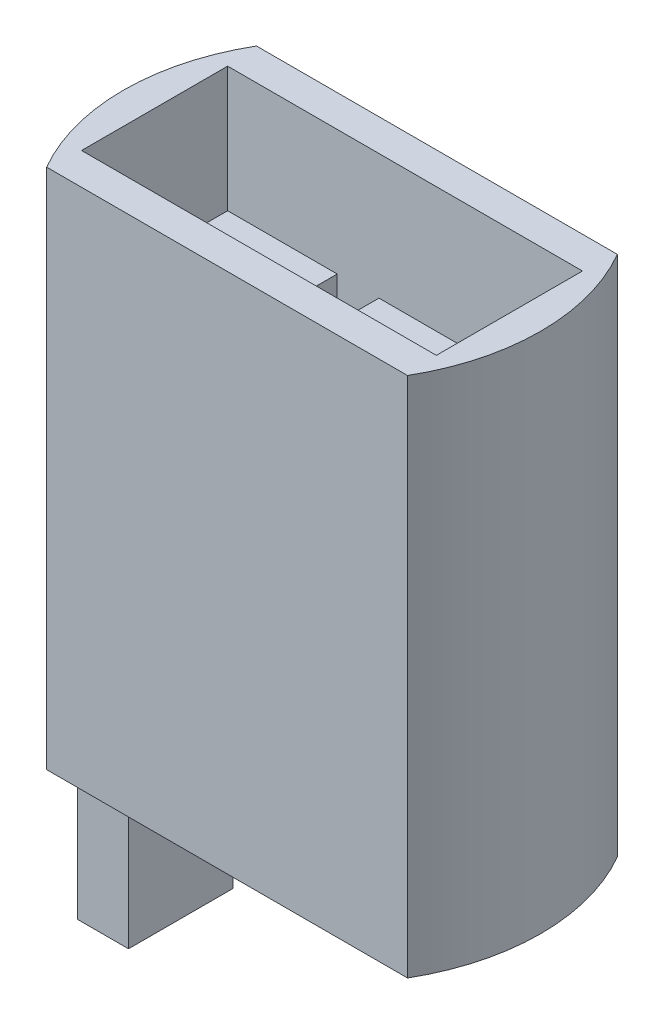
ISO-10303-21;
HEADER;
FILE_DESCRIPTION(('STEP AP214'),'2;1');
FILE_NAME('part.step','',(''),(''),'','','');
FILE_SCHEMA(('AUTOMOTIVE_DESIGN { 1 0 10303 214 1 1 1 1 }'));
ENDSEC;
DATA;
#1=APPLICATION_CONTEXT('core data for automotive mechanical design processes');
#2=APPLICATION_PROTOCOL_DEFINITION('international standard','automotive_design',2000,#1);
#3=PRODUCT_CONTEXT('',#1,'mechanical');
#4=PRODUCT('Part','Part','',(#3));
#5=PRODUCT_RELATED_PRODUCT_CATEGORY('part','',(#4));
#6=PRODUCT_DEFINITION_FORMATION('','',#4);
#7=PRODUCT_DEFINITION_CONTEXT('part definition',#1,'design');
#8=PRODUCT_DEFINITION('design','',#6,#7);
#9=PRODUCT_DEFINITION_SHAPE('','',#8);
#10=(LENGTH_UNIT() NAMED_UNIT(*) SI_UNIT(.MILLI.,.METRE.));
#11=(NAMED_UNIT(*) PLANE_ANGLE_UNIT() SI_UNIT($,.RADIAN.));
#12=(NAMED_UNIT(*) SI_UNIT($,.STERADIAN.) SOLID_ANGLE_UNIT());
#13=UNCERTAINTY_MEASURE_WITH_UNIT(LENGTH_MEASURE(1.E-05),#10,'distance_accuracy_value','');
#14=(GEOMETRIC_REPRESENTATION_CONTEXT(3) GLOBAL_UNCERTAINTY_ASSIGNED_CONTEXT((#13)) GLOBAL_UNIT_ASSIGNED_CONTEXT((#10,
#11,#12)) REPRESENTATION_CONTEXT('',''));
#15=CARTESIAN_POINT('',(0.,0.,0.));
#16=DIRECTION('',(0.,0.,1.));
#17=DIRECTION('',(1.,0.,0.));
#18=AXIS2_PLACEMENT_3D('',#15,#16,#17);
#19=CARTESIAN_POINT('',(-8.5,-8.,-2.5));
#20=DIRECTION('',(1.,0.,0.));
#21=DIRECTION('',(0.,0.,-1.));
#22=AXIS2_PLACEMENT_3D('',#19,#20,#21);
#23=PLANE('',#22);
#24=DIRECTION('',(0.,-1.,0.));
#25=VECTOR('',#24,1.);
#26=CARTESIAN_POINT('',(-8.5,-8.,1.5));
#27=LINE('',#26,#25);
#28=CARTESIAN_POINT('',(-8.5,-0.75,1.5));
#29=VERTEX_POINT('',#28);
#30=CARTESIAN_POINT('',(-8.5,-8.,1.5));
#31=VERTEX_POINT('',#30);
#32=EDGE_CURVE('E62',#29,#31,#27,.T.);
#33=ORIENTED_EDGE('',*,*,#32,.F.);
#34=DIRECTION('',(0.,0.,1.));
#35=VECTOR('',#34,1.);
#36=CARTESIAN_POINT('',(-8.5,-0.75,1.5));
#37=LINE('',#36,#35);
#38=CARTESIAN_POINT('',(-8.5,-0.75,-1.5));
#39=VERTEX_POINT('',#38);
#40=EDGE_CURVE('E175',#39,#29,#37,.T.);
#41=ORIENTED_EDGE('',*,*,#40,.F.);
#42=DIRECTION('',(0.,1.,0.));
#43=VECTOR('',#42,1.);
#44=CARTESIAN_POINT('',(-8.5,-0.75,-1.5));
#45=LINE('',#44,#43);
#46=CARTESIAN_POINT('',(-8.5,-8.,-1.5));
#47=VERTEX_POINT('',#46);
#48=EDGE_CURVE('E67',#47,#39,#45,.T.);
#49=ORIENTED_EDGE('',*,*,#48,.F.);
#50=DIRECTION('',(0.,0.,-1.));
#51=VECTOR('',#50,1.);
#52=CARTESIAN_POINT('',(-8.5,-8.,-2.5));
#53=LINE('',#52,#51);
#54=EDGE_CURVE('E133',#31,#47,#53,.T.);
#55=ORIENTED_EDGE('',*,*,#54,.F.);
#56=EDGE_LOOP('',(#33,#41,#49,#55));
#57=FACE_BOUND('',#56,.T.);
#58=ADVANCED_FACE('F48',(#57),#23,.F.);
#59=CARTESIAN_POINT('',(-8.5,-8.,-2.5));
#60=DIRECTION('',(0.,0.,1.));
#61=DIRECTION('',(1.,0.,0.));
#62=AXIS2_PLACEMENT_3D('',#59,#60,#61);
#63=PLANE('',#62);
#64=DIRECTION('',(1.,0.,0.));
#65=VECTOR('',#64,1.);
#66=CARTESIAN_POINT('',(-8.5,0.,-2.5));
#67=LINE('',#66,#65);
#68=CARTESIAN_POINT('',(-9.7,0.,-2.5));
#69=VERTEX_POINT('',#68);
#70=CARTESIAN_POINT('',(-7.25,0.,-2.5));
#71=VERTEX_POINT('',#70);
#72=EDGE_CURVE('E134',#69,#71,#67,.T.);
#73=ORIENTED_EDGE('',*,*,#72,.T.);
#74=DIRECTION('',(0.,1.,0.));
#75=VECTOR('',#74,1.);
#76=CARTESIAN_POINT('',(-7.25,-8.,-2.5));
#77=LINE('',#76,#75);
#78=CARTESIAN_POINT('',(-7.25,-8.,-2.5));
#79=VERTEX_POINT('',#78);
#80=EDGE_CURVE('E12',#79,#71,#77,.T.);
#81=ORIENTED_EDGE('',*,*,#80,.F.);
#82=DIRECTION('',(1.,0.,0.));
#83=VECTOR('',#82,1.);
#84=CARTESIAN_POINT('',(-8.5,-8.,-2.5));
#85=LINE('',#84,#83);
#86=CARTESIAN_POINT('',(-9.7,-8.,-2.5));
#87=VERTEX_POINT('',#86);
#88=EDGE_CURVE('E143',#87,#79,#85,.T.);
#89=ORIENTED_EDGE('',*,*,#88,.F.);
#90=DIRECTION('',(0.,-1.,0.));
#91=VECTOR('',#90,1.);
#92=CARTESIAN_POINT('',(-9.7,-8.,-2.5));
#93=LINE('',#92,#91);
#94=EDGE_CURVE('E128',#69,#87,#93,.T.);
#95=ORIENTED_EDGE('',*,*,#94,.F.);
#96=EDGE_LOOP('',(#73,#81,#89,#95));
#97=FACE_BOUND('',#96,.T.);
#98=ADVANCED_FACE('F188',(#97),#63,.F.);
#99=CARTESIAN_POINT('',(-7.25,-8.,-2.5));
#100=DIRECTION('',(-1.,0.,0.));
#101=DIRECTION('',(0.,0.,1.));
#102=AXIS2_PLACEMENT_3D('',#99,#100,#101);
#103=PLANE('',#102);
#104=DIRECTION('',(0.,0.,1.));
#105=VECTOR('',#104,1.);
#106=CARTESIAN_POINT('',(-7.25,0.,-2.5));
#107=LINE('',#106,#105);
#108=CARTESIAN_POINT('',(-7.25,0.,2.5));
#109=VERTEX_POINT('',#108);
#110=EDGE_CURVE('E136',#71,#109,#107,.T.);
#111=ORIENTED_EDGE('',*,*,#110,.T.);
#112=DIRECTION('',(0.,1.,0.));
#113=VECTOR('',#112,1.);
#114=CARTESIAN_POINT('',(-7.25,-8.,2.5));
#115=LINE('',#114,#113);
#116=CARTESIAN_POINT('',(-7.25,-8.,2.5));
#117=VERTEX_POINT('',#116);
#118=EDGE_CURVE('E55',#117,#109,#115,.T.);
#119=ORIENTED_EDGE('',*,*,#118,.F.);
#120=DIRECTION('',(0.,0.,1.));
#121=VECTOR('',#120,1.);
#122=CARTESIAN_POINT('',(-7.25,-8.,-2.5));
#123=LINE('',#122,#121);
#124=EDGE_CURVE('E146',#79,#117,#123,.T.);
#125=ORIENTED_EDGE('',*,*,#124,.F.);
#126=ORIENTED_EDGE('',*,*,#80,.T.);
#127=EDGE_LOOP('',(#111,#119,#125,#126));
#128=FACE_BOUND('',#127,.T.);
#129=ADVANCED_FACE('F192',(#128),#103,.F.);
#130=CARTESIAN_POINT('',(-8.5,-8.,2.5));
#131=DIRECTION('',(0.,0.,-1.));
#132=DIRECTION('',(-1.,0.,0.));
#133=AXIS2_PLACEMENT_3D('',#130,#131,#132);
#134=PLANE('',#133);
#135=DIRECTION('',(-1.,0.,0.));
#136=VECTOR('',#135,1.);
#137=CARTESIAN_POINT('',(-8.5,0.,2.5));
#138=LINE('',#137,#136);
#139=CARTESIAN_POINT('',(-9.7,0.,2.5));
#140=VERTEX_POINT('',#139);
#141=EDGE_CURVE('E144',#109,#140,#138,.T.);
#142=ORIENTED_EDGE('',*,*,#141,.T.);
#143=DIRECTION('',(0.,1.,0.));
#144=VECTOR('',#143,1.);
#145=CARTESIAN_POINT('',(-9.7,0.,2.5));
#146=LINE('',#145,#144);
#147=CARTESIAN_POINT('',(-9.7,-8.,2.5));
#148=VERTEX_POINT('',#147);
#149=EDGE_CURVE('E166',#148,#140,#146,.T.);
#150=ORIENTED_EDGE('',*,*,#149,.F.);
#151=DIRECTION('',(-1.,0.,0.));
#152=VECTOR('',#151,1.);
#153=CARTESIAN_POINT('',(-8.5,-8.,2.5));
#154=LINE('',#153,#152);
#155=EDGE_CURVE('E148',#117,#148,#154,.T.);
#156=ORIENTED_EDGE('',*,*,#155,.F.);
#157=ORIENTED_EDGE('',*,*,#118,.T.);
#158=EDGE_LOOP('',(#142,#150,#156,#157));
#159=FACE_BOUND('',#158,.T.);
#160=ADVANCED_FACE('F156',(#159),#134,.F.);
#161=CARTESIAN_POINT('',(0.,-8.,0.));
#162=DIRECTION('',(0.,1.,0.));
#163=DIRECTION('',(0.,0.,1.));
#164=AXIS2_PLACEMENT_3D('',#161,#162,#163);
#165=PLANE('',#164);
#166=ORIENTED_EDGE('',*,*,#155,.T.);
#167=DIRECTION('',(0.,0.,1.));
#168=VECTOR('',#167,1.);
#169=CARTESIAN_POINT('',(-9.7,-8.,2.5));
#170=LINE('',#169,#168);
#171=CARTESIAN_POINT('',(-9.7,-8.,1.5));
#172=VERTEX_POINT('',#171);
#173=EDGE_CURVE('E170',#172,#148,#170,.T.);
#174=ORIENTED_EDGE('',*,*,#173,.F.);
#175=DIRECTION('',(1.,0.,0.));
#176=VECTOR('',#175,1.);
#177=CARTESIAN_POINT('',(-9.7,-8.,1.5));
#178=LINE('',#177,#176);
#179=EDGE_CURVE('E168',#172,#31,#178,.T.);
#180=ORIENTED_EDGE('',*,*,#179,.T.);
#181=ORIENTED_EDGE('',*,*,#54,.T.);
#182=DIRECTION('',(1.,0.,0.));
#183=VECTOR('',#182,1.);
#184=CARTESIAN_POINT('',(-9.7,-8.,-1.5));
#185=LINE('',#184,#183);
#186=CARTESIAN_POINT('',(-9.7,-8.,-1.5));
#187=VERTEX_POINT('',#186);
#188=EDGE_CURVE('E115',#187,#47,#185,.T.);
#189=ORIENTED_EDGE('',*,*,#188,.F.);
#190=DIRECTION('',(0.,0.,1.));
#191=VECTOR('',#190,1.);
#192=CARTESIAN_POINT('',(-9.7,-8.,-1.5));
#193=LINE('',#192,#191);
#194=EDGE_CURVE('E121',#87,#187,#193,.T.);
#195=ORIENTED_EDGE('',*,*,#194,.F.);
#196=ORIENTED_EDGE('',*,*,#88,.T.);
#197=ORIENTED_EDGE('',*,*,#124,.T.);
#198=EDGE_LOOP('',(#166,#174,#180,#181,#189,#195,#196,#197));
#199=FACE_BOUND('',#198,.T.);
#200=ADVANCED_FACE('F131',(#199),#165,.F.);
#201=CARTESIAN_POINT('',(0.,0.,0.));
#202=DIRECTION('',(0.,1.,0.));
#203=DIRECTION('',(0.,0.,1.));
#204=AXIS2_PLACEMENT_3D('',#201,#202,#203);
#205=PLANE('',#204);
#206=ORIENTED_EDGE('',*,*,#72,.F.);
#207=DIRECTION('',(0.,0.,-1.));
#208=VECTOR('',#207,1.);
#209=CARTESIAN_POINT('',(-9.7,0.,-2.5));
#210=LINE('',#209,#208);
#211=EDGE_CURVE('E165',#140,#69,#210,.T.);
#212=ORIENTED_EDGE('',*,*,#211,.F.);
#213=ORIENTED_EDGE('',*,*,#141,.F.);
#214=ORIENTED_EDGE('',*,*,#110,.F.);
#215=EDGE_LOOP('',(#206,#212,#213,#214));
#216=FACE_BOUND('',#215,.T.);
#217=ADVANCED_FACE('F164',(#216),#205,.T.);
#218=CARTESIAN_POINT('',(-9.7,-0.75,-1.5));
#219=DIRECTION('',(0.,0.,-1.));
#220=DIRECTION('',(0.,1.,0.));
#221=AXIS2_PLACEMENT_3D('',#218,#219,#220);
#222=PLANE('',#221);
#223=ORIENTED_EDGE('',*,*,#48,.T.);
#224=DIRECTION('',(1.,0.,0.));
#225=VECTOR('',#224,1.);
#226=CARTESIAN_POINT('',(-9.7,-0.75,-1.5));
#227=LINE('',#226,#225);
#228=CARTESIAN_POINT('',(-9.7,-0.75,-1.5));
#229=VERTEX_POINT('',#228);
#230=EDGE_CURVE('E117',#229,#39,#227,.T.);
#231=ORIENTED_EDGE('',*,*,#230,.F.);
#232=DIRECTION('',(0.,1.,0.));
#233=VECTOR('',#232,1.);
#234=CARTESIAN_POINT('',(-9.7,-0.75,-1.5));
#235=LINE('',#234,#233);
#236=EDGE_CURVE('E111',#187,#229,#235,.T.);
#237=ORIENTED_EDGE('',*,*,#236,.F.);
#238=ORIENTED_EDGE('',*,*,#188,.T.);
#239=EDGE_LOOP('',(#223,#231,#237,#238));
#240=FACE_BOUND('',#239,.T.);
#241=ADVANCED_FACE('F113',(#240),#222,.F.);
#242=CARTESIAN_POINT('',(-9.7,-0.75,1.5));
#243=DIRECTION('',(0.,1.,0.));
#244=DIRECTION('',(0.,0.,1.));
#245=AXIS2_PLACEMENT_3D('',#242,#243,#244);
#246=PLANE('',#245);
#247=ORIENTED_EDGE('',*,*,#40,.T.);
#248=DIRECTION('',(1.,0.,0.));
#249=VECTOR('',#248,1.);
#250=CARTESIAN_POINT('',(-9.7,-0.75,1.5));
#251=LINE('',#250,#249);
#252=CARTESIAN_POINT('',(-9.7,-0.75,1.5));
#253=VERTEX_POINT('',#252);
#254=EDGE_CURVE('E138',#253,#29,#251,.T.);
#255=ORIENTED_EDGE('',*,*,#254,.F.);
#256=DIRECTION('',(0.,0.,1.));
#257=VECTOR('',#256,1.);
#258=CARTESIAN_POINT('',(-9.7,-0.75,1.5));
#259=LINE('',#258,#257);
#260=EDGE_CURVE('E120',#229,#253,#259,.T.);
#261=ORIENTED_EDGE('',*,*,#260,.F.);
#262=ORIENTED_EDGE('',*,*,#230,.T.);
#263=EDGE_LOOP('',(#247,#255,#261,#262));
#264=FACE_BOUND('',#263,.T.);
#265=ADVANCED_FACE('F186',(#264),#246,.F.);
#266=CARTESIAN_POINT('',(-9.7,-8.,1.5));
#267=DIRECTION('',(0.,0.,1.));
#268=DIRECTION('',(1.,0.,0.));
#269=AXIS2_PLACEMENT_3D('',#266,#267,#268);
#270=PLANE('',#269);
#271=ORIENTED_EDGE('',*,*,#32,.T.);
#272=ORIENTED_EDGE('',*,*,#179,.F.);
#273=DIRECTION('',(0.,-1.,0.));
#274=VECTOR('',#273,1.);
#275=CARTESIAN_POINT('',(-9.7,-8.,1.5));
#276=LINE('',#275,#274);
#277=EDGE_CURVE('E184',#253,#172,#276,.T.);
#278=ORIENTED_EDGE('',*,*,#277,.F.);
#279=ORIENTED_EDGE('',*,*,#254,.T.);
#280=EDGE_LOOP('',(#271,#272,#278,#279));
#281=FACE_BOUND('',#280,.T.);
#282=ADVANCED_FACE('F182',(#281),#270,.F.);
#283=CARTESIAN_POINT('',(-9.7,0.,0.));
#284=DIRECTION('',(1.,0.,0.));
#285=DIRECTION('',(0.,0.,-1.));
#286=AXIS2_PLACEMENT_3D('',#283,#284,#285);
#287=PLANE('',#286);
#288=ORIENTED_EDGE('',*,*,#194,.T.);
#289=ORIENTED_EDGE('',*,*,#236,.T.);
#290=ORIENTED_EDGE('',*,*,#260,.T.);
#291=ORIENTED_EDGE('',*,*,#277,.T.);
#292=ORIENTED_EDGE('',*,*,#173,.T.);
#293=ORIENTED_EDGE('',*,*,#149,.T.);
#294=ORIENTED_EDGE('',*,*,#211,.T.);
#295=ORIENTED_EDGE('',*,*,#94,.T.);
#296=EDGE_LOOP('',(#288,#289,#290,#291,#292,#293,#294,#295));
#297=FACE_BOUND('',#296,.T.);
#298=ADVANCED_FACE('F125',(#297),#287,.F.);
#299=CLOSED_SHELL('',(#58,#98,#129,#160,#200,#217,#241,#265,#282,#298));
#300=MANIFOLD_SOLID_BREP('B2',#299);
#301=CARTESIAN_POINT('',(0.,25.,0.));
#302=DIRECTION('',(0.,-1.,0.));
#303=DIRECTION('',(0.,0.,-1.));
#304=AXIS2_PLACEMENT_3D('',#301,#302,#303);
#305=CYLINDRICAL_SURFACE('',#304,10.);
#306=CARTESIAN_POINT('',(0.,25.,0.));
#307=DIRECTION('',(0.,1.,0.));
#308=DIRECTION('',(0.,0.,1.));
#309=AXIS2_PLACEMENT_3D('',#306,#307,#308);
#310=CIRCLE('',#309,10.);
#311=CARTESIAN_POINT('',(8.64463271574625,25.,5.02695983770008));
#312=VERTEX_POINT('',#311);
#313=CARTESIAN_POINT('',(8.64463271574627,25.,-5.02695983770008));
#314=VERTEX_POINT('',#313);
#315=EDGE_CURVE('E46',#312,#314,#310,.T.);
#316=ORIENTED_EDGE('',*,*,#315,.F.);
#317=DIRECTION('',(0.,-1.,0.));
#318=VECTOR('',#317,1.);
#319=CARTESIAN_POINT('',(8.64463271574625,25.,5.02695983770008));
#320=LINE('',#319,#318);
#321=CARTESIAN_POINT('',(8.64463271574625,0.,5.02695983770008));
#322=VERTEX_POINT('',#321);
#323=EDGE_CURVE('E382',#312,#322,#320,.T.);
#324=ORIENTED_EDGE('',*,*,#323,.T.);
#325=CARTESIAN_POINT('',(0.,0.,0.));
#326=DIRECTION('',(0.,1.,0.));
#327=DIRECTION('',(0.,0.,1.));
#328=AXIS2_PLACEMENT_3D('',#325,#326,#327);
#329=CIRCLE('',#328,10.);
#330=CARTESIAN_POINT('',(8.64463271574625,0.,-5.02695983770008));
#331=VERTEX_POINT('',#330);
#332=EDGE_CURVE('E294',#322,#331,#329,.T.);
#333=ORIENTED_EDGE('',*,*,#332,.T.);
#334=DIRECTION('',(0.,-1.,0.));
#335=VECTOR('',#334,1.);
#336=CARTESIAN_POINT('',(8.64463271574627,25.,-5.02695983770008));
#337=LINE('',#336,#335);
#338=EDGE_CURVE('E315',#314,#331,#337,.T.);
#339=ORIENTED_EDGE('',*,*,#338,.F.);
#340=EDGE_LOOP('',(#316,#324,#333,#339));
#341=FACE_BOUND('',#340,.T.);
#342=ADVANCED_FACE('F290',(#341),#305,.T.);
#343=CARTESIAN_POINT('',(0.,19.,0.));
#344=DIRECTION('',(0.,-1.,0.));
#345=DIRECTION('',(0.,0.,-1.));
#346=AXIS2_PLACEMENT_3D('',#343,#344,#345);
#347=PLANE('',#346);
#348=DIRECTION('',(0.,0.,-1.));
#349=VECTOR('',#348,1.);
#350=CARTESIAN_POINT('',(-1.25,19.,-3.5));
#351=LINE('',#350,#349);
#352=CARTESIAN_POINT('',(-1.25,19.,3.5));
#353=VERTEX_POINT('',#352);
#354=CARTESIAN_POINT('',(-1.25,19.,-3.5));
#355=VERTEX_POINT('',#354);
#356=EDGE_CURVE('E469',#353,#355,#351,.T.);
#357=ORIENTED_EDGE('',*,*,#356,.F.);
#358=DIRECTION('',(1.,0.,0.));
#359=VECTOR('',#358,1.);
#360=CARTESIAN_POINT('',(-8.5,19.,3.5));
#361=LINE('',#360,#359);
#362=CARTESIAN_POINT('',(8.5,19.,3.5));
#363=VERTEX_POINT('',#362);
#364=EDGE_CURVE('E448',#353,#363,#361,.T.);
#365=ORIENTED_EDGE('',*,*,#364,.T.);
#366=DIRECTION('',(0.,0.,-1.));
#367=VECTOR('',#366,1.);
#368=CARTESIAN_POINT('',(8.5,19.,3.5));
#369=LINE('',#368,#367);
#370=CARTESIAN_POINT('',(8.5,19.,-3.5));
#371=VERTEX_POINT('',#370);
#372=EDGE_CURVE('E440',#363,#371,#369,.T.);
#373=ORIENTED_EDGE('',*,*,#372,.T.);
#374=DIRECTION('',(-1.,0.,0.));
#375=VECTOR('',#374,1.);
#376=CARTESIAN_POINT('',(-8.5,19.,-3.5));
#377=LINE('',#376,#375);
#378=EDGE_CURVE('E410',#371,#355,#377,.T.);
#379=ORIENTED_EDGE('',*,*,#378,.T.);
#380=EDGE_LOOP('',(#357,#365,#373,#379));
#381=FACE_BOUND('',#380,.T.);
#382=ADVANCED_FACE('F518',(#381),#347,.F.);
#383=DIRECTION('',(0.,0.,1.));
#384=VECTOR('',#383,1.);
#385=CARTESIAN_POINT('',(-3.25,19.,-3.5));
#386=LINE('',#385,#384);
#387=CARTESIAN_POINT('',(-3.25,19.,-3.5));
#388=VERTEX_POINT('',#387);
#389=CARTESIAN_POINT('',(-3.25,19.,3.5));
#390=VERTEX_POINT('',#389);
#391=EDGE_CURVE('E464',#388,#390,#386,.T.);
#392=ORIENTED_EDGE('',*,*,#391,.F.);
#393=CARTESIAN_POINT('',(-8.5,19.,-3.5));
#394=VERTEX_POINT('',#393);
#395=EDGE_CURVE('E439',#388,#394,#377,.T.);
#396=ORIENTED_EDGE('',*,*,#395,.T.);
#397=DIRECTION('',(0.,0.,1.));
#398=VECTOR('',#397,1.);
#399=CARTESIAN_POINT('',(-8.5,19.,3.5));
#400=LINE('',#399,#398);
#401=CARTESIAN_POINT('',(-8.5,19.,3.5));
#402=VERTEX_POINT('',#401);
#403=EDGE_CURVE('E423',#394,#402,#400,.T.);
#404=ORIENTED_EDGE('',*,*,#403,.T.);
#405=EDGE_CURVE('E444',#402,#390,#361,.T.);
#406=ORIENTED_EDGE('',*,*,#405,.T.);
#407=EDGE_LOOP('',(#392,#396,#404,#406));
#408=FACE_BOUND('',#407,.T.);
#409=ADVANCED_FACE('F524',(#408),#347,.F.);
#410=CARTESIAN_POINT('',(-8.64463271574623,0.,-5.02695983770015));
#411=VERTEX_POINT('',#410);
#412=CARTESIAN_POINT('',(-8.64463271574625,0.,5.02695983770008));
#413=VERTEX_POINT('',#412);
#414=EDGE_CURVE('E394',#411,#413,#329,.T.);
#415=ORIENTED_EDGE('',*,*,#414,.T.);
#416=DIRECTION('',(0.,-1.,0.));
#417=VECTOR('',#416,1.);
#418=CARTESIAN_POINT('',(-8.64463271574625,25.,5.02695983770008));
#419=LINE('',#418,#417);
#420=CARTESIAN_POINT('',(-8.64463271574625,25.,5.02695983770008));
#421=VERTEX_POINT('',#420);
#422=EDGE_CURVE('E307',#421,#413,#419,.T.);
#423=ORIENTED_EDGE('',*,*,#422,.F.);
#424=CARTESIAN_POINT('',(-8.64463271574623,25.,-5.02695983770015));
#425=VERTEX_POINT('',#424);
#426=EDGE_CURVE('E300',#425,#421,#310,.T.);
#427=ORIENTED_EDGE('',*,*,#426,.F.);
#428=DIRECTION('',(0.,-1.,0.));
#429=VECTOR('',#428,1.);
#430=CARTESIAN_POINT('',(-8.64463271574623,25.,-5.02695983770015));
#431=LINE('',#430,#429);
#432=EDGE_CURVE('E489',#425,#411,#431,.T.);
#433=ORIENTED_EDGE('',*,*,#432,.T.);
#434=EDGE_LOOP('',(#415,#423,#427,#433));
#435=FACE_BOUND('',#434,.T.);
#436=ADVANCED_FACE('F292',(#435),#305,.T.);
#437=CARTESIAN_POINT('',(0.,25.,0.));
#438=DIRECTION('',(0.,1.,0.));
#439=DIRECTION('',(0.,0.,1.));
#440=AXIS2_PLACEMENT_3D('',#437,#438,#439);
#441=PLANE('',#440);
#442=DIRECTION('',(1.,0.,0.));
#443=VECTOR('',#442,1.);
#444=CARTESIAN_POINT('',(-8.64463271574625,25.,5.02695983770008));
#445=LINE('',#444,#443);
#446=EDGE_CURVE('E379',#421,#312,#445,.T.);
#447=ORIENTED_EDGE('',*,*,#446,.T.);
#448=ORIENTED_EDGE('',*,*,#315,.T.);
#449=DIRECTION('',(-1.,0.,0.));
#450=VECTOR('',#449,1.);
#451=CARTESIAN_POINT('',(-8.64463271574623,25.,-5.02695983770015));
#452=LINE('',#451,#450);
#453=EDGE_CURVE('E400',#314,#425,#452,.T.);
#454=ORIENTED_EDGE('',*,*,#453,.T.);
#455=ORIENTED_EDGE('',*,*,#426,.T.);
#456=EDGE_LOOP('',(#447,#448,#454,#455));
#457=FACE_BOUND('',#456,.T.);
#458=DIRECTION('',(0.,0.,1.));
#459=VECTOR('',#458,1.);
#460=CARTESIAN_POINT('',(-8.5,25.,3.5));
#461=LINE('',#460,#459);
#462=CARTESIAN_POINT('',(-8.5,25.,-3.5));
#463=VERTEX_POINT('',#462);
#464=CARTESIAN_POINT('',(-8.5,25.,3.5));
#465=VERTEX_POINT('',#464);
#466=EDGE_CURVE('E432',#463,#465,#461,.T.);
#467=ORIENTED_EDGE('',*,*,#466,.F.);
#468=DIRECTION('',(-1.,0.,0.));
#469=VECTOR('',#468,1.);
#470=CARTESIAN_POINT('',(-8.5,25.,-3.5));
#471=LINE('',#470,#469);
#472=CARTESIAN_POINT('',(8.5,25.,-3.5));
#473=VERTEX_POINT('',#472);
#474=EDGE_CURVE('E419',#473,#463,#471,.T.);
#475=ORIENTED_EDGE('',*,*,#474,.F.);
#476=DIRECTION('',(0.,0.,-1.));
#477=VECTOR('',#476,1.);
#478=CARTESIAN_POINT('',(8.5,25.,3.5));
#479=LINE('',#478,#477);
#480=CARTESIAN_POINT('',(8.5,25.,3.5));
#481=VERTEX_POINT('',#480);
#482=EDGE_CURVE('E424',#481,#473,#479,.T.);
#483=ORIENTED_EDGE('',*,*,#482,.F.);
#484=DIRECTION('',(1.,0.,0.));
#485=VECTOR('',#484,1.);
#486=CARTESIAN_POINT('',(-8.5,25.,3.5));
#487=LINE('',#486,#485);
#488=EDGE_CURVE('E428',#465,#481,#487,.T.);
#489=ORIENTED_EDGE('',*,*,#488,.F.);
#490=EDGE_LOOP('',(#467,#475,#483,#489));
#491=FACE_BOUND('',#490,.T.);
#492=ADVANCED_FACE('F398',(#457,#491),#441,.T.);
#493=CARTESIAN_POINT('',(0.,0.,0.));
#494=DIRECTION('',(0.,1.,0.));
#495=DIRECTION('',(0.,0.,1.));
#496=AXIS2_PLACEMENT_3D('',#493,#494,#495);
#497=PLANE('',#496);
#498=ORIENTED_EDGE('',*,*,#332,.F.);
#499=DIRECTION('',(1.,0.,0.));
#500=VECTOR('',#499,1.);
#501=CARTESIAN_POINT('',(-8.64463271574625,0.,5.02695983770008));
#502=LINE('',#501,#500);
#503=EDGE_CURVE('E387',#413,#322,#502,.T.);
#504=ORIENTED_EDGE('',*,*,#503,.F.);
#505=ORIENTED_EDGE('',*,*,#414,.F.);
#506=DIRECTION('',(-1.,0.,0.));
#507=VECTOR('',#506,1.);
#508=CARTESIAN_POINT('',(-8.64463271574623,0.,-5.02695983770015));
#509=LINE('',#508,#507);
#510=EDGE_CURVE('E492',#331,#411,#509,.T.);
#511=ORIENTED_EDGE('',*,*,#510,.F.);
#512=EDGE_LOOP('',(#498,#504,#505,#511));
#513=FACE_BOUND('',#512,.T.);
#514=ADVANCED_FACE('F503',(#513),#497,.F.);
#515=CARTESIAN_POINT('',(-8.5,19.,3.5));
#516=DIRECTION('',(-1.,0.,0.));
#517=DIRECTION('',(0.,0.,1.));
#518=AXIS2_PLACEMENT_3D('',#515,#516,#517);
#519=PLANE('',#518);
#520=ORIENTED_EDGE('',*,*,#466,.T.);
#521=DIRECTION('',(0.,1.,0.));
#522=VECTOR('',#521,1.);
#523=CARTESIAN_POINT('',(-8.5,19.,3.5));
#524=LINE('',#523,#522);
#525=EDGE_CURVE('E405',#402,#465,#524,.T.);
#526=ORIENTED_EDGE('',*,*,#525,.F.);
#527=ORIENTED_EDGE('',*,*,#403,.F.);
#528=DIRECTION('',(0.,1.,0.));
#529=VECTOR('',#528,1.);
#530=CARTESIAN_POINT('',(-8.5,19.,-3.5));
#531=LINE('',#530,#529);
#532=EDGE_CURVE('E416',#394,#463,#531,.T.);
#533=ORIENTED_EDGE('',*,*,#532,.T.);
#534=EDGE_LOOP('',(#520,#526,#527,#533));
#535=FACE_BOUND('',#534,.T.);
#536=ADVANCED_FACE('F544',(#535),#519,.F.);
#537=CARTESIAN_POINT('',(-8.5,19.,-3.5));
#538=DIRECTION('',(0.,0.,-1.));
#539=DIRECTION('',(-1.,0.,0.));
#540=AXIS2_PLACEMENT_3D('',#537,#538,#539);
#541=PLANE('',#540);
#542=ORIENTED_EDGE('',*,*,#474,.T.);
#543=ORIENTED_EDGE('',*,*,#532,.F.);
#544=ORIENTED_EDGE('',*,*,#395,.F.);
#545=DIRECTION('',(0.,1.,0.));
#546=VECTOR('',#545,1.);
#547=CARTESIAN_POINT('',(-3.25,15.,-3.5));
#548=LINE('',#547,#546);
#549=CARTESIAN_POINT('',(-3.25,15.,-3.5));
#550=VERTEX_POINT('',#549);
#551=EDGE_CURVE('E455',#550,#388,#548,.T.);
#552=ORIENTED_EDGE('',*,*,#551,.F.);
#553=DIRECTION('',(-1.,0.,0.));
#554=VECTOR('',#553,1.);
#555=CARTESIAN_POINT('',(-1.25,15.,-3.5));
#556=LINE('',#555,#554);
#557=CARTESIAN_POINT('',(-1.25,15.,-3.5));
#558=VERTEX_POINT('',#557);
#559=EDGE_CURVE('E480',#558,#550,#556,.T.);
#560=ORIENTED_EDGE('',*,*,#559,.F.);
#561=DIRECTION('',(0.,1.,0.));
#562=VECTOR('',#561,1.);
#563=CARTESIAN_POINT('',(-1.25,15.,-3.5));
#564=LINE('',#563,#562);
#565=EDGE_CURVE('E452',#558,#355,#564,.T.);
#566=ORIENTED_EDGE('',*,*,#565,.T.);
#567=ORIENTED_EDGE('',*,*,#378,.F.);
#568=DIRECTION('',(0.,1.,0.));
#569=VECTOR('',#568,1.);
#570=CARTESIAN_POINT('',(8.5,19.,-3.5));
#571=LINE('',#570,#569);
#572=EDGE_CURVE('E413',#371,#473,#571,.T.);
#573=ORIENTED_EDGE('',*,*,#572,.T.);
#574=EDGE_LOOP('',(#542,#543,#544,#552,#560,#566,#567,#573));
#575=FACE_BOUND('',#574,.T.);
#576=ADVANCED_FACE('F540',(#575),#541,.F.);
#577=CARTESIAN_POINT('',(8.5,19.,3.5));
#578=DIRECTION('',(1.,0.,0.));
#579=DIRECTION('',(0.,0.,-1.));
#580=AXIS2_PLACEMENT_3D('',#577,#578,#579);
#581=PLANE('',#580);
#582=ORIENTED_EDGE('',*,*,#482,.T.);
#583=ORIENTED_EDGE('',*,*,#572,.F.);
#584=ORIENTED_EDGE('',*,*,#372,.F.);
#585=DIRECTION('',(0.,1.,0.));
#586=VECTOR('',#585,1.);
#587=CARTESIAN_POINT('',(8.5,19.,3.5));
#588=LINE('',#587,#586);
#589=EDGE_CURVE('E409',#363,#481,#588,.T.);
#590=ORIENTED_EDGE('',*,*,#589,.T.);
#591=EDGE_LOOP('',(#582,#583,#584,#590));
#592=FACE_BOUND('',#591,.T.);
#593=ADVANCED_FACE('F543',(#592),#581,.F.);
#594=CARTESIAN_POINT('',(-8.5,19.,3.5));
#595=DIRECTION('',(0.,0.,1.));
#596=DIRECTION('',(1.,0.,0.));
#597=AXIS2_PLACEMENT_3D('',#594,#595,#596);
#598=PLANE('',#597);
#599=ORIENTED_EDGE('',*,*,#488,.T.);
#600=ORIENTED_EDGE('',*,*,#589,.F.);
#601=ORIENTED_EDGE('',*,*,#364,.F.);
#602=DIRECTION('',(0.,1.,0.));
#603=VECTOR('',#602,1.);
#604=CARTESIAN_POINT('',(-1.25,15.,3.5));
#605=LINE('',#604,#603);
#606=CARTESIAN_POINT('',(-1.25,15.,3.5));
#607=VERTEX_POINT('',#606);
#608=EDGE_CURVE('E435',#607,#353,#605,.T.);
#609=ORIENTED_EDGE('',*,*,#608,.F.);
#610=DIRECTION('',(1.,0.,0.));
#611=VECTOR('',#610,1.);
#612=CARTESIAN_POINT('',(-1.25,15.,3.5));
#613=LINE('',#612,#611);
#614=CARTESIAN_POINT('',(-3.25,15.,3.5));
#615=VERTEX_POINT('',#614);
#616=EDGE_CURVE('E456',#615,#607,#613,.T.);
#617=ORIENTED_EDGE('',*,*,#616,.F.);
#618=DIRECTION('',(0.,1.,0.));
#619=VECTOR('',#618,1.);
#620=CARTESIAN_POINT('',(-3.25,15.,3.5));
#621=LINE('',#620,#619);
#622=EDGE_CURVE('E459',#615,#390,#621,.T.);
#623=ORIENTED_EDGE('',*,*,#622,.T.);
#624=ORIENTED_EDGE('',*,*,#405,.F.);
#625=ORIENTED_EDGE('',*,*,#525,.T.);
#626=EDGE_LOOP('',(#599,#600,#601,#609,#617,#623,#624,#625));
#627=FACE_BOUND('',#626,.T.);
#628=ADVANCED_FACE('F548',(#627),#598,.F.);
#629=CARTESIAN_POINT('',(-1.25,15.,-3.5));
#630=DIRECTION('',(1.,0.,0.));
#631=DIRECTION('',(0.,0.,-1.));
#632=AXIS2_PLACEMENT_3D('',#629,#630,#631);
#633=PLANE('',#632);
#634=ORIENTED_EDGE('',*,*,#356,.T.);
#635=ORIENTED_EDGE('',*,*,#565,.F.);
#636=DIRECTION('',(0.,0.,-1.));
#637=VECTOR('',#636,1.);
#638=CARTESIAN_POINT('',(-1.25,15.,-3.5));
#639=LINE('',#638,#637);
#640=EDGE_CURVE('E468',#607,#558,#639,.T.);
#641=ORIENTED_EDGE('',*,*,#640,.F.);
#642=ORIENTED_EDGE('',*,*,#608,.T.);
#643=EDGE_LOOP('',(#634,#635,#641,#642));
#644=FACE_BOUND('',#643,.T.);
#645=ADVANCED_FACE('F538',(#644),#633,.F.);
#646=CARTESIAN_POINT('',(-3.25,15.,-3.5));
#647=DIRECTION('',(-1.,0.,0.));
#648=DIRECTION('',(0.,0.,1.));
#649=AXIS2_PLACEMENT_3D('',#646,#647,#648);
#650=PLANE('',#649);
#651=ORIENTED_EDGE('',*,*,#391,.T.);
#652=ORIENTED_EDGE('',*,*,#622,.F.);
#653=DIRECTION('',(0.,0.,1.));
#654=VECTOR('',#653,1.);
#655=CARTESIAN_POINT('',(-3.25,15.,-3.5));
#656=LINE('',#655,#654);
#657=EDGE_CURVE('E476',#550,#615,#656,.T.);
#658=ORIENTED_EDGE('',*,*,#657,.F.);
#659=ORIENTED_EDGE('',*,*,#551,.T.);
#660=EDGE_LOOP('',(#651,#652,#658,#659));
#661=FACE_BOUND('',#660,.T.);
#662=ADVANCED_FACE('F514',(#661),#650,.F.);
#663=CARTESIAN_POINT('',(0.,15.,0.));
#664=DIRECTION('',(0.,-1.,0.));
#665=DIRECTION('',(0.,0.,-1.));
#666=AXIS2_PLACEMENT_3D('',#663,#664,#665);
#667=PLANE('',#666);
#668=ORIENTED_EDGE('',*,*,#640,.T.);
#669=ORIENTED_EDGE('',*,*,#559,.T.);
#670=ORIENTED_EDGE('',*,*,#657,.T.);
#671=ORIENTED_EDGE('',*,*,#616,.T.);
#672=EDGE_LOOP('',(#668,#669,#670,#671));
#673=FACE_BOUND('',#672,.T.);
#674=ADVANCED_FACE('F506',(#673),#667,.F.);
#675=CARTESIAN_POINT('',(-8.64463271574623,25.,-5.02695983770015));
#676=DIRECTION('',(0.,0.,1.));
#677=DIRECTION('',(1.,0.,0.));
#678=AXIS2_PLACEMENT_3D('',#675,#676,#677);
#679=PLANE('',#678);
#680=ORIENTED_EDGE('',*,*,#510,.T.);
#681=ORIENTED_EDGE('',*,*,#432,.F.);
#682=ORIENTED_EDGE('',*,*,#453,.F.);
#683=ORIENTED_EDGE('',*,*,#338,.T.);
#684=EDGE_LOOP('',(#680,#681,#682,#683));
#685=FACE_BOUND('',#684,.T.);
#686=ADVANCED_FACE('F504',(#685),#679,.F.);
#687=CARTESIAN_POINT('',(-8.64463271574625,25.,5.02695983770008));
#688=DIRECTION('',(0.,0.,-1.));
#689=DIRECTION('',(-1.,0.,0.));
#690=AXIS2_PLACEMENT_3D('',#687,#688,#689);
#691=PLANE('',#690);
#692=ORIENTED_EDGE('',*,*,#503,.T.);
#693=ORIENTED_EDGE('',*,*,#323,.F.);
#694=ORIENTED_EDGE('',*,*,#446,.F.);
#695=ORIENTED_EDGE('',*,*,#422,.T.);
#696=EDGE_LOOP('',(#692,#693,#694,#695));
#697=FACE_BOUND('',#696,.T.);
#698=ADVANCED_FACE('F380',(#697),#691,.F.);
#699=CLOSED_SHELL('',(#342,#382,#409,#436,#492,#514,#536,#576,#593,#628,#645,#662,#674,#686,#698));
#700=MANIFOLD_SOLID_BREP('B6',#699);
#701=ADVANCED_BREP_SHAPE_REPRESENTATION('',(#18,#300,#700),#14);
#702=SHAPE_DEFINITION_REPRESENTATION(#9,#701);
ENDSEC;
END-ISO-10303-21;
